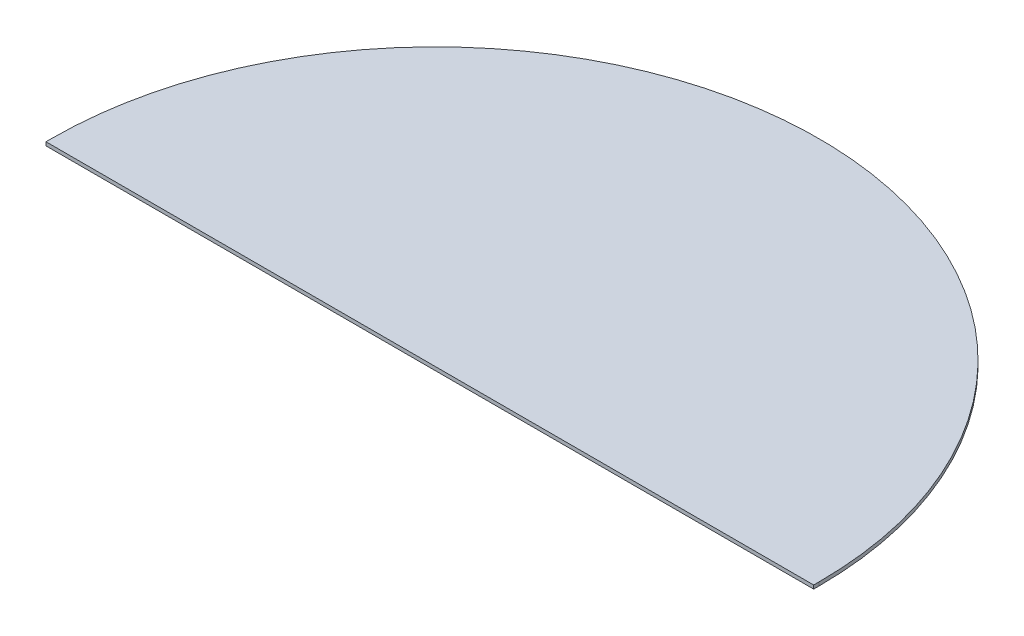
ISO-10303-21;
HEADER;
FILE_DESCRIPTION(('STEP AP214'),'2;1');
FILE_NAME('part.step','',(''),(''),'','','');
FILE_SCHEMA(('AUTOMOTIVE_DESIGN { 1 0 10303 214 1 1 1 1 }'));
ENDSEC;
DATA;
#1=APPLICATION_CONTEXT('core data for automotive mechanical design processes');
#2=APPLICATION_PROTOCOL_DEFINITION('international standard','automotive_design',2000,#1);
#3=PRODUCT_CONTEXT('',#1,'mechanical');
#4=PRODUCT('Part','Part','',(#3));
#5=PRODUCT_RELATED_PRODUCT_CATEGORY('part','',(#4));
#6=PRODUCT_DEFINITION_FORMATION('','',#4);
#7=PRODUCT_DEFINITION_CONTEXT('part definition',#1,'design');
#8=PRODUCT_DEFINITION('design','',#6,#7);
#9=PRODUCT_DEFINITION_SHAPE('','',#8);
#10=(LENGTH_UNIT() NAMED_UNIT(*) SI_UNIT(.MILLI.,.METRE.));
#11=(NAMED_UNIT(*) PLANE_ANGLE_UNIT() SI_UNIT($,.RADIAN.));
#12=(NAMED_UNIT(*) SI_UNIT($,.STERADIAN.) SOLID_ANGLE_UNIT());
#13=UNCERTAINTY_MEASURE_WITH_UNIT(LENGTH_MEASURE(1.E-05),#10,'distance_accuracy_value','');
#14=(GEOMETRIC_REPRESENTATION_CONTEXT(3) GLOBAL_UNCERTAINTY_ASSIGNED_CONTEXT((#13)) GLOBAL_UNIT_ASSIGNED_CONTEXT((#10,
#11,#12)) REPRESENTATION_CONTEXT('',''));
#15=CARTESIAN_POINT('',(0.,0.,0.));
#16=DIRECTION('',(0.,0.,1.));
#17=DIRECTION('',(1.,0.,0.));
#18=AXIS2_PLACEMENT_3D('',#15,#16,#17);
#19=CARTESIAN_POINT('',(1065.,10.,0.));
#20=DIRECTION('',(0.,-1.,0.));
#21=DIRECTION('',(0.,0.,-1.));
#22=AXIS2_PLACEMENT_3D('',#19,#20,#21);
#23=CYLINDRICAL_SURFACE('',#22,1065.);
#24=CARTESIAN_POINT('',(1065.,0.,0.));
#25=DIRECTION('',(0.,1.,0.));
#26=DIRECTION('',(0.,0.,-1.));
#27=AXIS2_PLACEMENT_3D('',#24,#25,#26);
#28=CIRCLE('',#27,1065.);
#29=CARTESIAN_POINT('',(2130.,0.,0.));
#30=VERTEX_POINT('',#29);
#31=CARTESIAN_POINT('',(0.,0.,0.));
#32=VERTEX_POINT('',#31);
#33=EDGE_CURVE('E107',#30,#32,#28,.T.);
#34=ORIENTED_EDGE('',*,*,#33,.T.);
#35=DIRECTION('',(0.,-1.,0.));
#36=VECTOR('',#35,1.);
#37=CARTESIAN_POINT('',(0.,10.,0.));
#38=LINE('',#37,#36);
#39=CARTESIAN_POINT('',(0.,10.,0.));
#40=VERTEX_POINT('',#39);
#41=EDGE_CURVE('E11',#40,#32,#38,.T.);
#42=ORIENTED_EDGE('',*,*,#41,.F.);
#43=CARTESIAN_POINT('',(1065.,10.,0.));
#44=DIRECTION('',(0.,1.,0.));
#45=DIRECTION('',(0.,0.,-1.));
#46=AXIS2_PLACEMENT_3D('',#43,#44,#45);
#47=CIRCLE('',#46,1065.);
#48=CARTESIAN_POINT('',(2130.,10.,0.));
#49=VERTEX_POINT('',#48);
#50=EDGE_CURVE('E91',#49,#40,#47,.T.);
#51=ORIENTED_EDGE('',*,*,#50,.F.);
#52=DIRECTION('',(0.,-1.,0.));
#53=VECTOR('',#52,1.);
#54=CARTESIAN_POINT('',(2130.,10.,0.));
#55=LINE('',#54,#53);
#56=EDGE_CURVE('E103',#49,#30,#55,.T.);
#57=ORIENTED_EDGE('',*,*,#56,.T.);
#58=EDGE_LOOP('',(#34,#42,#51,#57));
#59=FACE_BOUND('',#58,.T.);
#60=ADVANCED_FACE('F39',(#59),#23,.T.);
#61=CARTESIAN_POINT('',(0.,10.,0.));
#62=DIRECTION('',(1.,0.,0.));
#63=DIRECTION('',(0.,0.,-1.));
#64=AXIS2_PLACEMENT_3D('',#61,#62,#63);
#65=PLANE('',#64);
#66=DIRECTION('',(0.,0.,1.));
#67=VECTOR('',#66,1.);
#68=CARTESIAN_POINT('',(0.,0.,0.));
#69=LINE('',#68,#67);
#70=CARTESIAN_POINT('',(0.,0.,15.));
#71=VERTEX_POINT('',#70);
#72=EDGE_CURVE('E96',#32,#71,#69,.T.);
#73=ORIENTED_EDGE('',*,*,#72,.T.);
#74=DIRECTION('',(0.,-1.,0.));
#75=VECTOR('',#74,1.);
#76=CARTESIAN_POINT('',(0.,10.,15.));
#77=LINE('',#76,#75);
#78=CARTESIAN_POINT('',(0.,10.,15.));
#79=VERTEX_POINT('',#78);
#80=EDGE_CURVE('E48',#79,#71,#77,.T.);
#81=ORIENTED_EDGE('',*,*,#80,.F.);
#82=DIRECTION('',(0.,0.,1.));
#83=VECTOR('',#82,1.);
#84=CARTESIAN_POINT('',(0.,10.,0.));
#85=LINE('',#84,#83);
#86=EDGE_CURVE('E86',#40,#79,#85,.T.);
#87=ORIENTED_EDGE('',*,*,#86,.F.);
#88=ORIENTED_EDGE('',*,*,#41,.T.);
#89=EDGE_LOOP('',(#73,#81,#87,#88));
#90=FACE_BOUND('',#89,.T.);
#91=ADVANCED_FACE('F95',(#90),#65,.F.);
#92=CARTESIAN_POINT('',(0.,10.,15.));
#93=DIRECTION('',(0.,0.,-1.));
#94=DIRECTION('',(-1.,0.,0.));
#95=AXIS2_PLACEMENT_3D('',#92,#93,#94);
#96=PLANE('',#95);
#97=DIRECTION('',(1.,0.,0.));
#98=VECTOR('',#97,1.);
#99=CARTESIAN_POINT('',(0.,0.,15.));
#100=LINE('',#99,#98);
#101=CARTESIAN_POINT('',(2130.,0.,15.));
#102=VERTEX_POINT('',#101);
#103=EDGE_CURVE('E73',#71,#102,#100,.T.);
#104=ORIENTED_EDGE('',*,*,#103,.T.);
#105=DIRECTION('',(0.,-1.,0.));
#106=VECTOR('',#105,1.);
#107=CARTESIAN_POINT('',(2130.,10.,15.));
#108=LINE('',#107,#106);
#109=CARTESIAN_POINT('',(2130.,10.,15.));
#110=VERTEX_POINT('',#109);
#111=EDGE_CURVE('E98',#110,#102,#108,.T.);
#112=ORIENTED_EDGE('',*,*,#111,.F.);
#113=DIRECTION('',(1.,0.,0.));
#114=VECTOR('',#113,1.);
#115=CARTESIAN_POINT('',(0.,10.,15.));
#116=LINE('',#115,#114);
#117=EDGE_CURVE('E89',#79,#110,#116,.T.);
#118=ORIENTED_EDGE('',*,*,#117,.F.);
#119=ORIENTED_EDGE('',*,*,#80,.T.);
#120=EDGE_LOOP('',(#104,#112,#118,#119));
#121=FACE_BOUND('',#120,.T.);
#122=ADVANCED_FACE('F99',(#121),#96,.F.);
#123=CARTESIAN_POINT('',(2130.,10.,15.));
#124=DIRECTION('',(-1.,0.,0.));
#125=DIRECTION('',(0.,0.,1.));
#126=AXIS2_PLACEMENT_3D('',#123,#124,#125);
#127=PLANE('',#126);
#128=DIRECTION('',(0.,0.,-1.));
#129=VECTOR('',#128,1.);
#130=CARTESIAN_POINT('',(2130.,0.,15.));
#131=LINE('',#130,#129);
#132=EDGE_CURVE('E79',#102,#30,#131,.T.);
#133=ORIENTED_EDGE('',*,*,#132,.T.);
#134=ORIENTED_EDGE('',*,*,#56,.F.);
#135=DIRECTION('',(0.,0.,-1.));
#136=VECTOR('',#135,1.);
#137=CARTESIAN_POINT('',(2130.,10.,15.));
#138=LINE('',#137,#136);
#139=EDGE_CURVE('E56',#110,#49,#138,.T.);
#140=ORIENTED_EDGE('',*,*,#139,.F.);
#141=ORIENTED_EDGE('',*,*,#111,.T.);
#142=EDGE_LOOP('',(#133,#134,#140,#141));
#143=FACE_BOUND('',#142,.T.);
#144=ADVANCED_FACE('F120',(#143),#127,.F.);
#145=CARTESIAN_POINT('',(1065.,10.,0.));
#146=DIRECTION('',(0.,-1.,0.));
#147=DIRECTION('',(0.,0.,-1.));
#148=AXIS2_PLACEMENT_3D('',#145,#146,#147);
#149=PLANE('',#148);
#150=ORIENTED_EDGE('',*,*,#50,.T.);
#151=ORIENTED_EDGE('',*,*,#86,.T.);
#152=ORIENTED_EDGE('',*,*,#117,.T.);
#153=ORIENTED_EDGE('',*,*,#139,.T.);
#154=EDGE_LOOP('',(#150,#151,#152,#153));
#155=FACE_BOUND('',#154,.T.);
#156=ADVANCED_FACE('F87',(#155),#149,.F.);
#157=CARTESIAN_POINT('',(1065.,0.,0.));
#158=DIRECTION('',(0.,-1.,0.));
#159=DIRECTION('',(0.,0.,-1.));
#160=AXIS2_PLACEMENT_3D('',#157,#158,#159);
#161=PLANE('',#160);
#162=ORIENTED_EDGE('',*,*,#33,.F.);
#163=ORIENTED_EDGE('',*,*,#132,.F.);
#164=ORIENTED_EDGE('',*,*,#103,.F.);
#165=ORIENTED_EDGE('',*,*,#72,.F.);
#166=EDGE_LOOP('',(#162,#163,#164,#165));
#167=FACE_BOUND('',#166,.T.);
#168=ADVANCED_FACE('F123',(#167),#161,.T.);
#169=CLOSED_SHELL('',(#60,#91,#122,#144,#156,#168));
#170=MANIFOLD_SOLID_BREP('B2',#169);
#171=ADVANCED_BREP_SHAPE_REPRESENTATION('',(#18,#170),#14);
#172=SHAPE_DEFINITION_REPRESENTATION(#9,#171);
ENDSEC;
END-ISO-10303-21;
